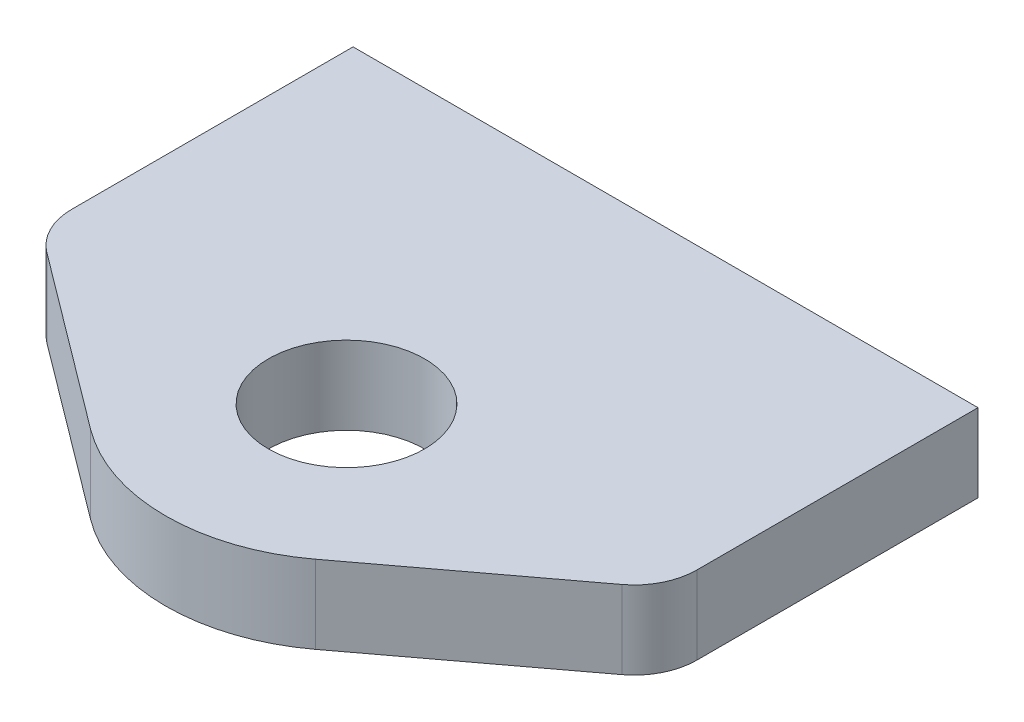
ISO-10303-21;
HEADER;
FILE_DESCRIPTION(('STEP AP214'),'2;1');
FILE_NAME('part.step','',(''),(''),'','','');
FILE_SCHEMA(('AUTOMOTIVE_DESIGN { 1 0 10303 214 1 1 1 1 }'));
ENDSEC;
DATA;
#1=APPLICATION_CONTEXT('core data for automotive mechanical design processes');
#2=APPLICATION_PROTOCOL_DEFINITION('international standard','automotive_design',2000,#1);
#3=PRODUCT_CONTEXT('',#1,'mechanical');
#4=PRODUCT('Part','Part','',(#3));
#5=PRODUCT_RELATED_PRODUCT_CATEGORY('part','',(#4));
#6=PRODUCT_DEFINITION_FORMATION('','',#4);
#7=PRODUCT_DEFINITION_CONTEXT('part definition',#1,'design');
#8=PRODUCT_DEFINITION('design','',#6,#7);
#9=PRODUCT_DEFINITION_SHAPE('','',#8);
#10=(LENGTH_UNIT() NAMED_UNIT(*) SI_UNIT(.MILLI.,.METRE.));
#11=(NAMED_UNIT(*) PLANE_ANGLE_UNIT() SI_UNIT($,.RADIAN.));
#12=(NAMED_UNIT(*) SI_UNIT($,.STERADIAN.) SOLID_ANGLE_UNIT());
#13=UNCERTAINTY_MEASURE_WITH_UNIT(LENGTH_MEASURE(1.E-05),#10,'distance_accuracy_value','');
#14=(GEOMETRIC_REPRESENTATION_CONTEXT(3) GLOBAL_UNCERTAINTY_ASSIGNED_CONTEXT((#13)) GLOBAL_UNIT_ASSIGNED_CONTEXT((#10,
#11,#12)) REPRESENTATION_CONTEXT('',''));
#15=CARTESIAN_POINT('',(0.,0.,0.));
#16=DIRECTION('',(0.,0.,1.));
#17=DIRECTION('',(1.,0.,0.));
#18=AXIS2_PLACEMENT_3D('',#15,#16,#17);
#19=CARTESIAN_POINT('',(0.,3.175,0.));
#20=DIRECTION('',(0.,-1.,0.));
#21=DIRECTION('',(0.,0.,-1.));
#22=AXIS2_PLACEMENT_3D('',#19,#20,#21);
#23=PLANE('',#22);
#24=DIRECTION('',(0.,0.,1.));
#25=VECTOR('',#24,1.);
#26=CARTESIAN_POINT('',(-12.7,3.175,6.35));
#27=LINE('',#26,#25);
#28=CARTESIAN_POINT('',(-12.7,3.175,-6.35));
#29=VERTEX_POINT('',#28);
#30=CARTESIAN_POINT('',(-12.7,3.175,5.08));
#31=VERTEX_POINT('',#30);
#32=EDGE_CURVE('E123',#29,#31,#27,.T.);
#33=ORIENTED_EDGE('',*,*,#32,.T.);
#34=CARTESIAN_POINT('',(-10.16,3.175,5.08));
#35=DIRECTION('',(0.,-1.,0.));
#36=DIRECTION('',(0.,0.,-1.));
#37=AXIS2_PLACEMENT_3D('',#34,#35,#36);
#38=CIRCLE('',#37,2.54);
#39=CARTESIAN_POINT('',(-11.684,3.175,7.112));
#40=VERTEX_POINT('',#39);
#41=EDGE_CURVE('E166',#31,#40,#38,.F.);
#42=ORIENTED_EDGE('',*,*,#41,.T.);
#43=DIRECTION('',(0.8,0.,0.6));
#44=VECTOR('',#43,1.);
#45=CARTESIAN_POINT('',(-12.7,3.175,6.35));
#46=LINE('',#45,#44);
#47=CARTESIAN_POINT('',(-4.572,3.175,12.446));
#48=VERTEX_POINT('',#47);
#49=EDGE_CURVE('E237',#40,#48,#46,.T.);
#50=ORIENTED_EDGE('',*,*,#49,.T.);
#51=CARTESIAN_POINT('',(0.,3.175,6.35));
#52=DIRECTION('',(0.,-1.,0.));
#53=DIRECTION('',(0.,0.,-1.));
#54=AXIS2_PLACEMENT_3D('',#51,#52,#53);
#55=CIRCLE('',#54,7.62);
#56=CARTESIAN_POINT('',(4.572,3.175,12.446));
#57=VERTEX_POINT('',#56);
#58=EDGE_CURVE('E148',#48,#57,#55,.F.);
#59=ORIENTED_EDGE('',*,*,#58,.T.);
#60=DIRECTION('',(0.8,0.,-0.6));
#61=VECTOR('',#60,1.);
#62=CARTESIAN_POINT('',(0.,3.175,15.875));
#63=LINE('',#62,#61);
#64=CARTESIAN_POINT('',(11.684,3.175,7.112));
#65=VERTEX_POINT('',#64);
#66=EDGE_CURVE('E137',#57,#65,#63,.T.);
#67=ORIENTED_EDGE('',*,*,#66,.T.);
#68=CARTESIAN_POINT('',(10.16,3.175,5.08));
#69=DIRECTION('',(0.,-1.,0.));
#70=DIRECTION('',(0.,0.,-1.));
#71=AXIS2_PLACEMENT_3D('',#68,#69,#70);
#72=CIRCLE('',#71,2.54);
#73=CARTESIAN_POINT('',(12.7,3.175,5.08));
#74=VERTEX_POINT('',#73);
#75=EDGE_CURVE('E55',#65,#74,#72,.F.);
#76=ORIENTED_EDGE('',*,*,#75,.T.);
#77=DIRECTION('',(0.,0.,-1.));
#78=VECTOR('',#77,1.);
#79=CARTESIAN_POINT('',(12.7,3.175,6.35));
#80=LINE('',#79,#78);
#81=CARTESIAN_POINT('',(12.7,3.175,-6.35));
#82=VERTEX_POINT('',#81);
#83=EDGE_CURVE('E102',#74,#82,#80,.T.);
#84=ORIENTED_EDGE('',*,*,#83,.T.);
#85=DIRECTION('',(-1.,0.,0.));
#86=VECTOR('',#85,1.);
#87=CARTESIAN_POINT('',(-12.7,3.175,-6.35));
#88=LINE('',#87,#86);
#89=EDGE_CURVE('E106',#82,#29,#88,.T.);
#90=ORIENTED_EDGE('',*,*,#89,.T.);
#91=EDGE_LOOP('',(#33,#42,#50,#59,#67,#76,#84,#90));
#92=FACE_BOUND('',#91,.T.);
#93=CARTESIAN_POINT('',(-0.266746272316709,3.175,6.35));
#94=DIRECTION('',(0.,1.,0.));
#95=DIRECTION('',(0.,0.,1.));
#96=AXIS2_PLACEMENT_3D('',#93,#94,#95);
#97=CIRCLE('',#96,3.175);
#98=CARTESIAN_POINT('',(-0.266746272316709,3.175,9.525));
#99=VERTEX_POINT('',#98);
#100=EDGE_CURVE('E178',#99,#99,#97,.T.);
#101=ORIENTED_EDGE('',*,*,#100,.F.);
#102=EDGE_LOOP('',(#101));
#103=FACE_BOUND('',#102,.T.);
#104=ADVANCED_FACE('F39',(#92,#103),#23,.F.);
#105=CARTESIAN_POINT('',(0.,0.,0.));
#106=DIRECTION('',(0.,-1.,0.));
#107=DIRECTION('',(0.,0.,-1.));
#108=AXIS2_PLACEMENT_3D('',#105,#106,#107);
#109=PLANE('',#108);
#110=DIRECTION('',(0.8,0.,0.6));
#111=VECTOR('',#110,1.);
#112=CARTESIAN_POINT('',(-12.7,0.,6.35));
#113=LINE('',#112,#111);
#114=CARTESIAN_POINT('',(-11.684,0.,7.112));
#115=VERTEX_POINT('',#114);
#116=CARTESIAN_POINT('',(-4.572,0.,12.446));
#117=VERTEX_POINT('',#116);
#118=EDGE_CURVE('E193',#115,#117,#113,.T.);
#119=ORIENTED_EDGE('',*,*,#118,.F.);
#120=CARTESIAN_POINT('',(-10.16,0.,5.08));
#121=DIRECTION('',(0.,-1.,0.));
#122=DIRECTION('',(0.,0.,-1.));
#123=AXIS2_PLACEMENT_3D('',#120,#121,#122);
#124=CIRCLE('',#123,2.54);
#125=CARTESIAN_POINT('',(-12.7,0.,5.08));
#126=VERTEX_POINT('',#125);
#127=EDGE_CURVE('E158',#115,#126,#124,.T.);
#128=ORIENTED_EDGE('',*,*,#127,.T.);
#129=DIRECTION('',(0.,0.,1.));
#130=VECTOR('',#129,1.);
#131=CARTESIAN_POINT('',(-12.7,0.,6.35));
#132=LINE('',#131,#130);
#133=CARTESIAN_POINT('',(-12.7,0.,-6.35));
#134=VERTEX_POINT('',#133);
#135=EDGE_CURVE('E182',#134,#126,#132,.T.);
#136=ORIENTED_EDGE('',*,*,#135,.F.);
#137=DIRECTION('',(-1.,0.,0.));
#138=VECTOR('',#137,1.);
#139=CARTESIAN_POINT('',(-12.7,0.,-6.35));
#140=LINE('',#139,#138);
#141=CARTESIAN_POINT('',(12.7,0.,-6.35));
#142=VERTEX_POINT('',#141);
#143=EDGE_CURVE('E176',#142,#134,#140,.T.);
#144=ORIENTED_EDGE('',*,*,#143,.F.);
#145=DIRECTION('',(0.,0.,-1.));
#146=VECTOR('',#145,1.);
#147=CARTESIAN_POINT('',(12.7,0.,6.35));
#148=LINE('',#147,#146);
#149=CARTESIAN_POINT('',(12.7,0.,5.08));
#150=VERTEX_POINT('',#149);
#151=EDGE_CURVE('E127',#150,#142,#148,.T.);
#152=ORIENTED_EDGE('',*,*,#151,.F.);
#153=CARTESIAN_POINT('',(10.16,0.,5.08));
#154=DIRECTION('',(0.,-1.,0.));
#155=DIRECTION('',(0.,0.,-1.));
#156=AXIS2_PLACEMENT_3D('',#153,#154,#155);
#157=CIRCLE('',#156,2.54);
#158=CARTESIAN_POINT('',(11.684,0.,7.112));
#159=VERTEX_POINT('',#158);
#160=EDGE_CURVE('E155',#150,#159,#157,.T.);
#161=ORIENTED_EDGE('',*,*,#160,.T.);
#162=DIRECTION('',(0.8,0.,-0.6));
#163=VECTOR('',#162,1.);
#164=CARTESIAN_POINT('',(0.,0.,15.875));
#165=LINE('',#164,#163);
#166=CARTESIAN_POINT('',(4.572,0.,12.446));
#167=VERTEX_POINT('',#166);
#168=EDGE_CURVE('E113',#167,#159,#165,.T.);
#169=ORIENTED_EDGE('',*,*,#168,.F.);
#170=CARTESIAN_POINT('',(0.,0.,6.35));
#171=DIRECTION('',(0.,-1.,0.));
#172=DIRECTION('',(0.,0.,-1.));
#173=AXIS2_PLACEMENT_3D('',#170,#171,#172);
#174=CIRCLE('',#173,7.62);
#175=EDGE_CURVE('E135',#167,#117,#174,.T.);
#176=ORIENTED_EDGE('',*,*,#175,.T.);
#177=EDGE_LOOP('',(#119,#128,#136,#144,#152,#161,#169,#176));
#178=FACE_BOUND('',#177,.T.);
#179=CARTESIAN_POINT('',(-0.266746272316709,0.,6.35));
#180=DIRECTION('',(0.,1.,0.));
#181=DIRECTION('',(0.,0.,1.));
#182=AXIS2_PLACEMENT_3D('',#179,#180,#181);
#183=CIRCLE('',#182,3.175);
#184=CARTESIAN_POINT('',(-0.266746272316709,0.,9.525));
#185=VERTEX_POINT('',#184);
#186=EDGE_CURVE('E185',#185,#185,#183,.T.);
#187=ORIENTED_EDGE('',*,*,#186,.T.);
#188=EDGE_LOOP('',(#187));
#189=FACE_BOUND('',#188,.T.);
#190=ADVANCED_FACE('F172',(#178,#189),#109,.T.);
#191=CARTESIAN_POINT('',(12.7,3.175,6.35));
#192=DIRECTION('',(-1.,0.,0.));
#193=DIRECTION('',(0.,0.,1.));
#194=AXIS2_PLACEMENT_3D('',#191,#192,#193);
#195=PLANE('',#194);
#196=ORIENTED_EDGE('',*,*,#83,.F.);
#197=DIRECTION('',(0.,-1.,0.));
#198=VECTOR('',#197,1.);
#199=CARTESIAN_POINT('',(12.7,3.175,5.08));
#200=LINE('',#199,#198);
#201=EDGE_CURVE('E48',#74,#150,#200,.T.);
#202=ORIENTED_EDGE('',*,*,#201,.T.);
#203=ORIENTED_EDGE('',*,*,#151,.T.);
#204=DIRECTION('',(0.,-1.,0.));
#205=VECTOR('',#204,1.);
#206=CARTESIAN_POINT('',(12.7,3.175,-6.35));
#207=LINE('',#206,#205);
#208=EDGE_CURVE('E118',#82,#142,#207,.T.);
#209=ORIENTED_EDGE('',*,*,#208,.F.);
#210=EDGE_LOOP('',(#196,#202,#203,#209));
#211=FACE_BOUND('',#210,.T.);
#212=ADVANCED_FACE('F125',(#211),#195,.F.);
#213=CARTESIAN_POINT('',(-12.7,3.175,-6.35));
#214=DIRECTION('',(0.,0.,1.));
#215=DIRECTION('',(1.,0.,0.));
#216=AXIS2_PLACEMENT_3D('',#213,#214,#215);
#217=PLANE('',#216);
#218=ORIENTED_EDGE('',*,*,#143,.T.);
#219=DIRECTION('',(0.,-1.,0.));
#220=VECTOR('',#219,1.);
#221=CARTESIAN_POINT('',(-12.7,3.175,-6.35));
#222=LINE('',#221,#220);
#223=EDGE_CURVE('E120',#29,#134,#222,.T.);
#224=ORIENTED_EDGE('',*,*,#223,.F.);
#225=ORIENTED_EDGE('',*,*,#89,.F.);
#226=ORIENTED_EDGE('',*,*,#208,.T.);
#227=EDGE_LOOP('',(#218,#224,#225,#226));
#228=FACE_BOUND('',#227,.T.);
#229=ADVANCED_FACE('F117',(#228),#217,.F.);
#230=CARTESIAN_POINT('',(-12.7,3.175,6.35));
#231=DIRECTION('',(1.,0.,0.));
#232=DIRECTION('',(0.,0.,-1.));
#233=AXIS2_PLACEMENT_3D('',#230,#231,#232);
#234=PLANE('',#233);
#235=ORIENTED_EDGE('',*,*,#135,.T.);
#236=DIRECTION('',(0.,-1.,0.));
#237=VECTOR('',#236,1.);
#238=CARTESIAN_POINT('',(-12.7,3.175,5.08));
#239=LINE('',#238,#237);
#240=EDGE_CURVE('E161',#126,#31,#239,.F.);
#241=ORIENTED_EDGE('',*,*,#240,.T.);
#242=ORIENTED_EDGE('',*,*,#32,.F.);
#243=ORIENTED_EDGE('',*,*,#223,.T.);
#244=EDGE_LOOP('',(#235,#241,#242,#243));
#245=FACE_BOUND('',#244,.T.);
#246=ADVANCED_FACE('F219',(#245),#234,.F.);
#247=CARTESIAN_POINT('',(-12.7,3.175,6.35));
#248=DIRECTION('',(0.6,0.,-0.8));
#249=DIRECTION('',(-0.8,0.,-0.6));
#250=AXIS2_PLACEMENT_3D('',#247,#248,#249);
#251=PLANE('',#250);
#252=ORIENTED_EDGE('',*,*,#49,.F.);
#253=DIRECTION('',(0.,-1.,0.));
#254=VECTOR('',#253,1.);
#255=CARTESIAN_POINT('',(-11.684,3.175,7.112));
#256=LINE('',#255,#254);
#257=EDGE_CURVE('E151',#40,#115,#256,.T.);
#258=ORIENTED_EDGE('',*,*,#257,.T.);
#259=ORIENTED_EDGE('',*,*,#118,.T.);
#260=DIRECTION('',(0.,-1.,0.));
#261=VECTOR('',#260,1.);
#262=CARTESIAN_POINT('',(-4.572,3.175,12.446));
#263=LINE('',#262,#261);
#264=EDGE_CURVE('E144',#117,#48,#263,.F.);
#265=ORIENTED_EDGE('',*,*,#264,.T.);
#266=EDGE_LOOP('',(#252,#258,#259,#265));
#267=FACE_BOUND('',#266,.T.);
#268=ADVANCED_FACE('F216',(#267),#251,.F.);
#269=CARTESIAN_POINT('',(0.,3.175,15.875));
#270=DIRECTION('',(-0.6,0.,-0.8));
#271=DIRECTION('',(-0.8,0.,0.6));
#272=AXIS2_PLACEMENT_3D('',#269,#270,#271);
#273=PLANE('',#272);
#274=ORIENTED_EDGE('',*,*,#168,.T.);
#275=DIRECTION('',(0.,-1.,0.));
#276=VECTOR('',#275,1.);
#277=CARTESIAN_POINT('',(11.684,3.175,7.112));
#278=LINE('',#277,#276);
#279=EDGE_CURVE('E11',#159,#65,#278,.F.);
#280=ORIENTED_EDGE('',*,*,#279,.T.);
#281=ORIENTED_EDGE('',*,*,#66,.F.);
#282=DIRECTION('',(0.,-1.,0.));
#283=VECTOR('',#282,1.);
#284=CARTESIAN_POINT('',(4.572,3.175,12.446));
#285=LINE('',#284,#283);
#286=EDGE_CURVE('E130',#57,#167,#285,.T.);
#287=ORIENTED_EDGE('',*,*,#286,.T.);
#288=EDGE_LOOP('',(#274,#280,#281,#287));
#289=FACE_BOUND('',#288,.T.);
#290=ADVANCED_FACE('F196',(#289),#273,.F.);
#291=CARTESIAN_POINT('',(-0.266746272316709,3.175,6.35));
#292=DIRECTION('',(0.,-1.,0.));
#293=DIRECTION('',(0.,0.,-1.));
#294=AXIS2_PLACEMENT_3D('',#291,#292,#293);
#295=CYLINDRICAL_SURFACE('',#294,3.175);
#296=ORIENTED_EDGE('',*,*,#100,.T.);
#297=EDGE_LOOP('',(#296));
#298=FACE_BOUND('',#297,.T.);
#299=ORIENTED_EDGE('',*,*,#186,.F.);
#300=EDGE_LOOP('',(#299));
#301=FACE_BOUND('',#300,.T.);
#302=ADVANCED_FACE('F212',(#298,#301),#295,.F.);
#303=CARTESIAN_POINT('',(0.,3.175,6.35));
#304=DIRECTION('',(0.,-1.,0.));
#305=DIRECTION('',(0.,0.,-1.));
#306=AXIS2_PLACEMENT_3D('',#303,#304,#305);
#307=CYLINDRICAL_SURFACE('',#306,7.62);
#308=ORIENTED_EDGE('',*,*,#58,.F.);
#309=ORIENTED_EDGE('',*,*,#264,.F.);
#310=ORIENTED_EDGE('',*,*,#175,.F.);
#311=ORIENTED_EDGE('',*,*,#286,.F.);
#312=EDGE_LOOP('',(#308,#309,#310,#311));
#313=FACE_BOUND('',#312,.T.);
#314=ADVANCED_FACE('F203',(#313),#307,.T.);
#315=CARTESIAN_POINT('',(-10.16,3.175,5.08));
#316=DIRECTION('',(0.,-1.,0.));
#317=DIRECTION('',(0.,0.,-1.));
#318=AXIS2_PLACEMENT_3D('',#315,#316,#317);
#319=CYLINDRICAL_SURFACE('',#318,2.54);
#320=ORIENTED_EDGE('',*,*,#41,.F.);
#321=ORIENTED_EDGE('',*,*,#240,.F.);
#322=ORIENTED_EDGE('',*,*,#127,.F.);
#323=ORIENTED_EDGE('',*,*,#257,.F.);
#324=EDGE_LOOP('',(#320,#321,#322,#323));
#325=FACE_BOUND('',#324,.T.);
#326=ADVANCED_FACE('F199',(#325),#319,.T.);
#327=CARTESIAN_POINT('',(10.16,3.175,5.08));
#328=DIRECTION('',(0.,-1.,0.));
#329=DIRECTION('',(0.,0.,-1.));
#330=AXIS2_PLACEMENT_3D('',#327,#328,#329);
#331=CYLINDRICAL_SURFACE('',#330,2.54);
#332=ORIENTED_EDGE('',*,*,#75,.F.);
#333=ORIENTED_EDGE('',*,*,#279,.F.);
#334=ORIENTED_EDGE('',*,*,#160,.F.);
#335=ORIENTED_EDGE('',*,*,#201,.F.);
#336=EDGE_LOOP('',(#332,#333,#334,#335));
#337=FACE_BOUND('',#336,.T.);
#338=ADVANCED_FACE('F41',(#337),#331,.T.);
#339=CLOSED_SHELL('',(#104,#190,#212,#229,#246,#268,#290,#302,#314,#326,#338));
#340=MANIFOLD_SOLID_BREP('B2',#339);
#341=ADVANCED_BREP_SHAPE_REPRESENTATION('',(#18,#340),#14);
#342=SHAPE_DEFINITION_REPRESENTATION(#9,#341);
ENDSEC;
END-ISO-10303-21;
